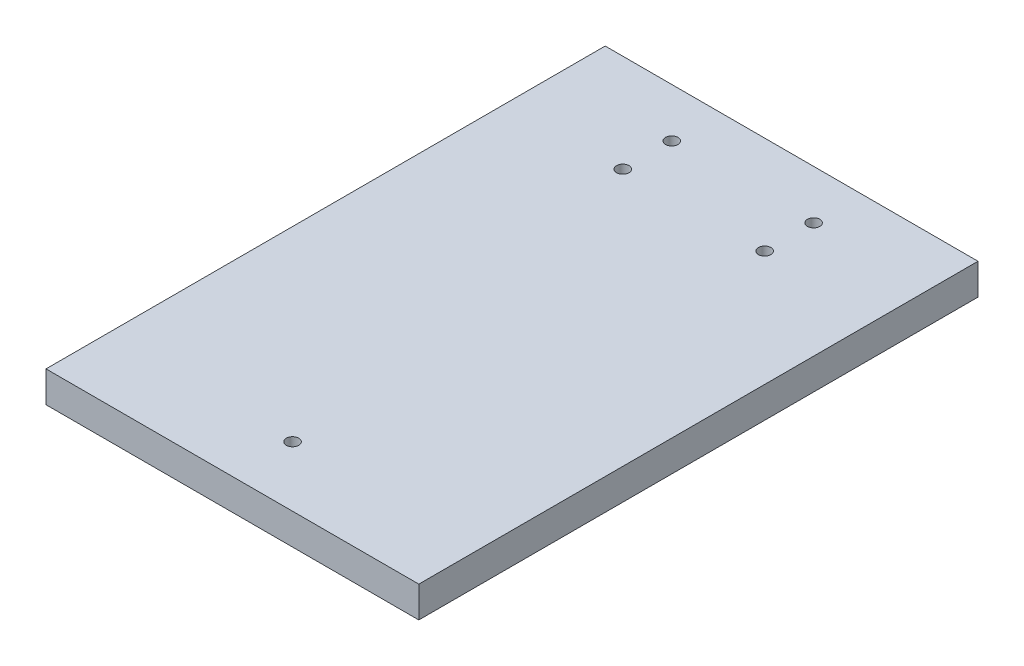
ISO-10303-21;
HEADER;
FILE_DESCRIPTION(('STEP AP214'),'2;1');
FILE_NAME('part.step','',(''),(''),'','','');
FILE_SCHEMA(('AUTOMOTIVE_DESIGN { 1 0 10303 214 1 1 1 1 }'));
ENDSEC;
DATA;
#1=APPLICATION_CONTEXT('core data for automotive mechanical design processes');
#2=APPLICATION_PROTOCOL_DEFINITION('international standard','automotive_design',2000,#1);
#3=PRODUCT_CONTEXT('',#1,'mechanical');
#4=PRODUCT('Part','Part','',(#3));
#5=PRODUCT_RELATED_PRODUCT_CATEGORY('part','',(#4));
#6=PRODUCT_DEFINITION_FORMATION('','',#4);
#7=PRODUCT_DEFINITION_CONTEXT('part definition',#1,'design');
#8=PRODUCT_DEFINITION('design','',#6,#7);
#9=PRODUCT_DEFINITION_SHAPE('','',#8);
#10=(LENGTH_UNIT() NAMED_UNIT(*) SI_UNIT(.MILLI.,.METRE.));
#11=(NAMED_UNIT(*) PLANE_ANGLE_UNIT() SI_UNIT($,.RADIAN.));
#12=(NAMED_UNIT(*) SI_UNIT($,.STERADIAN.) SOLID_ANGLE_UNIT());
#13=UNCERTAINTY_MEASURE_WITH_UNIT(LENGTH_MEASURE(1.E-05),#10,'distance_accuracy_value','');
#14=(GEOMETRIC_REPRESENTATION_CONTEXT(3) GLOBAL_UNCERTAINTY_ASSIGNED_CONTEXT((#13)) GLOBAL_UNIT_ASSIGNED_CONTEXT((#10,
#11,#12)) REPRESENTATION_CONTEXT('',''));
#15=CARTESIAN_POINT('',(0.,0.,0.));
#16=DIRECTION('',(0.,0.,1.));
#17=DIRECTION('',(1.,0.,0.));
#18=AXIS2_PLACEMENT_3D('',#15,#16,#17);
#19=CARTESIAN_POINT('',(0.,6.35,0.));
#20=DIRECTION('',(0.,-1.,0.));
#21=DIRECTION('',(0.,0.,-1.));
#22=AXIS2_PLACEMENT_3D('',#19,#20,#21);
#23=PLANE('',#22);
#24=DIRECTION('',(0.,0.,-1.));
#25=VECTOR('',#24,1.);
#26=CARTESIAN_POINT('',(38.1,6.35,57.15));
#27=LINE('',#26,#25);
#28=CARTESIAN_POINT('',(38.1,6.35,57.15));
#29=VERTEX_POINT('',#28);
#30=CARTESIAN_POINT('',(38.1,6.35,-57.15));
#31=VERTEX_POINT('',#30);
#32=EDGE_CURVE('E86',#29,#31,#27,.T.);
#33=ORIENTED_EDGE('',*,*,#32,.T.);
#34=DIRECTION('',(-1.,0.,0.));
#35=VECTOR('',#34,1.);
#36=CARTESIAN_POINT('',(-38.1,6.35,-57.15));
#37=LINE('',#36,#35);
#38=CARTESIAN_POINT('',(-38.1,6.35,-57.15));
#39=VERTEX_POINT('',#38);
#40=EDGE_CURVE('E81',#31,#39,#37,.T.);
#41=ORIENTED_EDGE('',*,*,#40,.T.);
#42=DIRECTION('',(0.,0.,1.));
#43=VECTOR('',#42,1.);
#44=CARTESIAN_POINT('',(-38.1,6.35,57.15));
#45=LINE('',#44,#43);
#46=CARTESIAN_POINT('',(-38.1,6.35,57.15));
#47=VERTEX_POINT('',#46);
#48=EDGE_CURVE('E84',#39,#47,#45,.T.);
#49=ORIENTED_EDGE('',*,*,#48,.T.);
#50=DIRECTION('',(1.,0.,0.));
#51=VECTOR('',#50,1.);
#52=CARTESIAN_POINT('',(-38.1,6.35,57.15));
#53=LINE('',#52,#51);
#54=EDGE_CURVE('E51',#47,#29,#53,.T.);
#55=ORIENTED_EDGE('',*,*,#54,.T.);
#56=EDGE_LOOP('',(#33,#41,#49,#55));
#57=FACE_BOUND('',#56,.T.);
#58=CARTESIAN_POINT('',(-14.5,6.35,-47.15));
#59=DIRECTION('',(0.,1.,0.));
#60=DIRECTION('',(0.,0.,1.));
#61=AXIS2_PLACEMENT_3D('',#58,#59,#60);
#62=CIRCLE('',#61,1.27);
#63=CARTESIAN_POINT('',(-14.5,6.35,-45.88));
#64=VERTEX_POINT('',#63);
#65=EDGE_CURVE('E101',#64,#64,#62,.T.);
#66=ORIENTED_EDGE('',*,*,#65,.F.);
#67=EDGE_LOOP('',(#66));
#68=FACE_BOUND('',#67,.T.);
#69=CARTESIAN_POINT('',(14.5,6.35,-47.15));
#70=DIRECTION('',(0.,1.,0.));
#71=DIRECTION('',(0.,0.,1.));
#72=AXIS2_PLACEMENT_3D('',#69,#70,#71);
#73=CIRCLE('',#72,1.27);
#74=CARTESIAN_POINT('',(14.5,6.35,-45.88));
#75=VERTEX_POINT('',#74);
#76=EDGE_CURVE('E116',#75,#75,#73,.T.);
#77=ORIENTED_EDGE('',*,*,#76,.F.);
#78=EDGE_LOOP('',(#77));
#79=FACE_BOUND('',#78,.T.);
#80=CARTESIAN_POINT('',(0.,6.35,44.85));
#81=DIRECTION('',(0.,1.,0.));
#82=DIRECTION('',(0.,0.,1.));
#83=AXIS2_PLACEMENT_3D('',#80,#81,#82);
#84=CIRCLE('',#83,1.27);
#85=CARTESIAN_POINT('',(0.,6.35,46.12));
#86=VERTEX_POINT('',#85);
#87=EDGE_CURVE('E122',#86,#86,#84,.T.);
#88=ORIENTED_EDGE('',*,*,#87,.F.);
#89=EDGE_LOOP('',(#88));
#90=FACE_BOUND('',#89,.T.);
#91=CARTESIAN_POINT('',(-14.5,6.35,-37.15));
#92=DIRECTION('',(0.,1.,0.));
#93=DIRECTION('',(0.,0.,1.));
#94=AXIS2_PLACEMENT_3D('',#91,#92,#93);
#95=CIRCLE('',#94,1.27);
#96=CARTESIAN_POINT('',(-14.5,6.35,-35.88));
#97=VERTEX_POINT('',#96);
#98=EDGE_CURVE('E128',#97,#97,#95,.T.);
#99=ORIENTED_EDGE('',*,*,#98,.F.);
#100=EDGE_LOOP('',(#99));
#101=FACE_BOUND('',#100,.T.);
#102=CARTESIAN_POINT('',(14.5,6.35,-37.15));
#103=DIRECTION('',(0.,1.,0.));
#104=DIRECTION('',(0.,0.,1.));
#105=AXIS2_PLACEMENT_3D('',#102,#103,#104);
#106=CIRCLE('',#105,1.27);
#107=CARTESIAN_POINT('',(14.5,6.35,-35.88));
#108=VERTEX_POINT('',#107);
#109=EDGE_CURVE('E134',#108,#108,#106,.T.);
#110=ORIENTED_EDGE('',*,*,#109,.F.);
#111=EDGE_LOOP('',(#110));
#112=FACE_BOUND('',#111,.T.);
#113=ADVANCED_FACE('F34',(#57,#68,#79,#90,#101,#112),#23,.F.);
#114=CARTESIAN_POINT('',(0.,0.,0.));
#115=DIRECTION('',(0.,-1.,0.));
#116=DIRECTION('',(0.,0.,-1.));
#117=AXIS2_PLACEMENT_3D('',#114,#115,#116);
#118=PLANE('',#117);
#119=CARTESIAN_POINT('',(-14.5,0.,-37.15));
#120=DIRECTION('',(0.,1.,0.));
#121=DIRECTION('',(0.,0.,1.));
#122=AXIS2_PLACEMENT_3D('',#119,#120,#121);
#123=CIRCLE('',#122,1.27);
#124=CARTESIAN_POINT('',(-14.5,0.,-35.88));
#125=VERTEX_POINT('',#124);
#126=EDGE_CURVE('E131',#125,#125,#123,.T.);
#127=ORIENTED_EDGE('',*,*,#126,.T.);
#128=EDGE_LOOP('',(#127));
#129=FACE_BOUND('',#128,.T.);
#130=CARTESIAN_POINT('',(14.5,0.,-47.15));
#131=DIRECTION('',(0.,1.,0.));
#132=DIRECTION('',(0.,0.,1.));
#133=AXIS2_PLACEMENT_3D('',#130,#131,#132);
#134=CIRCLE('',#133,1.27);
#135=CARTESIAN_POINT('',(14.5,0.,-45.88));
#136=VERTEX_POINT('',#135);
#137=EDGE_CURVE('E119',#136,#136,#134,.T.);
#138=ORIENTED_EDGE('',*,*,#137,.T.);
#139=EDGE_LOOP('',(#138));
#140=FACE_BOUND('',#139,.T.);
#141=DIRECTION('',(0.,0.,-1.));
#142=VECTOR('',#141,1.);
#143=CARTESIAN_POINT('',(38.1,0.,57.15));
#144=LINE('',#143,#142);
#145=CARTESIAN_POINT('',(38.1,0.,57.15));
#146=VERTEX_POINT('',#145);
#147=CARTESIAN_POINT('',(38.1,0.,-57.15));
#148=VERTEX_POINT('',#147);
#149=EDGE_CURVE('E98',#146,#148,#144,.T.);
#150=ORIENTED_EDGE('',*,*,#149,.F.);
#151=DIRECTION('',(1.,0.,0.));
#152=VECTOR('',#151,1.);
#153=CARTESIAN_POINT('',(-38.1,0.,57.15));
#154=LINE('',#153,#152);
#155=CARTESIAN_POINT('',(-38.1,0.,57.15));
#156=VERTEX_POINT('',#155);
#157=EDGE_CURVE('E74',#156,#146,#154,.T.);
#158=ORIENTED_EDGE('',*,*,#157,.F.);
#159=DIRECTION('',(0.,0.,1.));
#160=VECTOR('',#159,1.);
#161=CARTESIAN_POINT('',(-38.1,0.,57.15));
#162=LINE('',#161,#160);
#163=CARTESIAN_POINT('',(-38.1,0.,-57.15));
#164=VERTEX_POINT('',#163);
#165=EDGE_CURVE('E68',#164,#156,#162,.T.);
#166=ORIENTED_EDGE('',*,*,#165,.F.);
#167=DIRECTION('',(-1.,0.,0.));
#168=VECTOR('',#167,1.);
#169=CARTESIAN_POINT('',(-38.1,0.,-57.15));
#170=LINE('',#169,#168);
#171=EDGE_CURVE('E90',#148,#164,#170,.T.);
#172=ORIENTED_EDGE('',*,*,#171,.F.);
#173=EDGE_LOOP('',(#150,#158,#166,#172));
#174=FACE_BOUND('',#173,.T.);
#175=CARTESIAN_POINT('',(-14.5,0.,-47.15));
#176=DIRECTION('',(0.,1.,0.));
#177=DIRECTION('',(0.,0.,1.));
#178=AXIS2_PLACEMENT_3D('',#175,#176,#177);
#179=CIRCLE('',#178,1.27);
#180=CARTESIAN_POINT('',(-14.5,0.,-45.88));
#181=VERTEX_POINT('',#180);
#182=EDGE_CURVE('E113',#181,#181,#179,.T.);
#183=ORIENTED_EDGE('',*,*,#182,.T.);
#184=EDGE_LOOP('',(#183));
#185=FACE_BOUND('',#184,.T.);
#186=CARTESIAN_POINT('',(0.,0.,44.85));
#187=DIRECTION('',(0.,1.,0.));
#188=DIRECTION('',(0.,0.,1.));
#189=AXIS2_PLACEMENT_3D('',#186,#187,#188);
#190=CIRCLE('',#189,1.27);
#191=CARTESIAN_POINT('',(0.,0.,46.12));
#192=VERTEX_POINT('',#191);
#193=EDGE_CURVE('E125',#192,#192,#190,.T.);
#194=ORIENTED_EDGE('',*,*,#193,.T.);
#195=EDGE_LOOP('',(#194));
#196=FACE_BOUND('',#195,.T.);
#197=CARTESIAN_POINT('',(14.5,0.,-37.15));
#198=DIRECTION('',(0.,1.,0.));
#199=DIRECTION('',(0.,0.,1.));
#200=AXIS2_PLACEMENT_3D('',#197,#198,#199);
#201=CIRCLE('',#200,1.27);
#202=CARTESIAN_POINT('',(14.5,0.,-35.88));
#203=VERTEX_POINT('',#202);
#204=EDGE_CURVE('E137',#203,#203,#201,.T.);
#205=ORIENTED_EDGE('',*,*,#204,.T.);
#206=EDGE_LOOP('',(#205));
#207=FACE_BOUND('',#206,.T.);
#208=ADVANCED_FACE('F109',(#129,#140,#174,#185,#196,#207),#118,.T.);
#209=CARTESIAN_POINT('',(38.1,6.35,57.15));
#210=DIRECTION('',(-1.,0.,0.));
#211=DIRECTION('',(0.,0.,1.));
#212=AXIS2_PLACEMENT_3D('',#209,#210,#211);
#213=PLANE('',#212);
#214=ORIENTED_EDGE('',*,*,#149,.T.);
#215=DIRECTION('',(0.,-1.,0.));
#216=VECTOR('',#215,1.);
#217=CARTESIAN_POINT('',(38.1,6.35,-57.15));
#218=LINE('',#217,#216);
#219=EDGE_CURVE('E11',#31,#148,#218,.T.);
#220=ORIENTED_EDGE('',*,*,#219,.F.);
#221=ORIENTED_EDGE('',*,*,#32,.F.);
#222=DIRECTION('',(0.,-1.,0.));
#223=VECTOR('',#222,1.);
#224=CARTESIAN_POINT('',(38.1,6.35,57.15));
#225=LINE('',#224,#223);
#226=EDGE_CURVE('E94',#29,#146,#225,.T.);
#227=ORIENTED_EDGE('',*,*,#226,.T.);
#228=EDGE_LOOP('',(#214,#220,#221,#227));
#229=FACE_BOUND('',#228,.T.);
#230=ADVANCED_FACE('F36',(#229),#213,.F.);
#231=CARTESIAN_POINT('',(-38.1,6.35,-57.15));
#232=DIRECTION('',(0.,0.,1.));
#233=DIRECTION('',(1.,0.,0.));
#234=AXIS2_PLACEMENT_3D('',#231,#232,#233);
#235=PLANE('',#234);
#236=ORIENTED_EDGE('',*,*,#171,.T.);
#237=DIRECTION('',(0.,-1.,0.));
#238=VECTOR('',#237,1.);
#239=CARTESIAN_POINT('',(-38.1,6.35,-57.15));
#240=LINE('',#239,#238);
#241=EDGE_CURVE('E43',#39,#164,#240,.T.);
#242=ORIENTED_EDGE('',*,*,#241,.F.);
#243=ORIENTED_EDGE('',*,*,#40,.F.);
#244=ORIENTED_EDGE('',*,*,#219,.T.);
#245=EDGE_LOOP('',(#236,#242,#243,#244));
#246=FACE_BOUND('',#245,.T.);
#247=ADVANCED_FACE('F89',(#246),#235,.F.);
#248=CARTESIAN_POINT('',(-38.1,6.35,57.15));
#249=DIRECTION('',(1.,0.,0.));
#250=DIRECTION('',(0.,0.,-1.));
#251=AXIS2_PLACEMENT_3D('',#248,#249,#250);
#252=PLANE('',#251);
#253=ORIENTED_EDGE('',*,*,#165,.T.);
#254=DIRECTION('',(0.,-1.,0.));
#255=VECTOR('',#254,1.);
#256=CARTESIAN_POINT('',(-38.1,6.35,57.15));
#257=LINE('',#256,#255);
#258=EDGE_CURVE('E91',#47,#156,#257,.T.);
#259=ORIENTED_EDGE('',*,*,#258,.F.);
#260=ORIENTED_EDGE('',*,*,#48,.F.);
#261=ORIENTED_EDGE('',*,*,#241,.T.);
#262=EDGE_LOOP('',(#253,#259,#260,#261));
#263=FACE_BOUND('',#262,.T.);
#264=ADVANCED_FACE('F92',(#263),#252,.F.);
#265=CARTESIAN_POINT('',(-38.1,6.35,57.15));
#266=DIRECTION('',(0.,0.,-1.));
#267=DIRECTION('',(-1.,0.,0.));
#268=AXIS2_PLACEMENT_3D('',#265,#266,#267);
#269=PLANE('',#268);
#270=ORIENTED_EDGE('',*,*,#157,.T.);
#271=ORIENTED_EDGE('',*,*,#226,.F.);
#272=ORIENTED_EDGE('',*,*,#54,.F.);
#273=ORIENTED_EDGE('',*,*,#258,.T.);
#274=EDGE_LOOP('',(#270,#271,#272,#273));
#275=FACE_BOUND('',#274,.T.);
#276=ADVANCED_FACE('F106',(#275),#269,.F.);
#277=CARTESIAN_POINT('',(-14.5,6.35,-47.15));
#278=DIRECTION('',(0.,-1.,0.));
#279=DIRECTION('',(0.,0.,-1.));
#280=AXIS2_PLACEMENT_3D('',#277,#278,#279);
#281=CYLINDRICAL_SURFACE('',#280,1.27);
#282=ORIENTED_EDGE('',*,*,#65,.T.);
#283=EDGE_LOOP('',(#282));
#284=FACE_BOUND('',#283,.T.);
#285=ORIENTED_EDGE('',*,*,#182,.F.);
#286=EDGE_LOOP('',(#285));
#287=FACE_BOUND('',#286,.T.);
#288=ADVANCED_FACE('F154',(#284,#287),#281,.F.);
#289=CARTESIAN_POINT('',(14.5,6.35,-47.15));
#290=DIRECTION('',(0.,-1.,0.));
#291=DIRECTION('',(0.,0.,-1.));
#292=AXIS2_PLACEMENT_3D('',#289,#290,#291);
#293=CYLINDRICAL_SURFACE('',#292,1.27);
#294=ORIENTED_EDGE('',*,*,#76,.T.);
#295=EDGE_LOOP('',(#294));
#296=FACE_BOUND('',#295,.T.);
#297=ORIENTED_EDGE('',*,*,#137,.F.);
#298=EDGE_LOOP('',(#297));
#299=FACE_BOUND('',#298,.T.);
#300=ADVANCED_FACE('F200',(#296,#299),#293,.F.);
#301=CARTESIAN_POINT('',(0.,6.35,44.85));
#302=DIRECTION('',(0.,-1.,0.));
#303=DIRECTION('',(0.,0.,-1.));
#304=AXIS2_PLACEMENT_3D('',#301,#302,#303);
#305=CYLINDRICAL_SURFACE('',#304,1.27);
#306=ORIENTED_EDGE('',*,*,#87,.T.);
#307=EDGE_LOOP('',(#306));
#308=FACE_BOUND('',#307,.T.);
#309=ORIENTED_EDGE('',*,*,#193,.F.);
#310=EDGE_LOOP('',(#309));
#311=FACE_BOUND('',#310,.T.);
#312=ADVANCED_FACE('F208',(#308,#311),#305,.F.);
#313=CARTESIAN_POINT('',(-14.5,6.35,-37.15));
#314=DIRECTION('',(0.,-1.,0.));
#315=DIRECTION('',(0.,0.,-1.));
#316=AXIS2_PLACEMENT_3D('',#313,#314,#315);
#317=CYLINDRICAL_SURFACE('',#316,1.27);
#318=ORIENTED_EDGE('',*,*,#98,.T.);
#319=EDGE_LOOP('',(#318));
#320=FACE_BOUND('',#319,.T.);
#321=ORIENTED_EDGE('',*,*,#126,.F.);
#322=EDGE_LOOP('',(#321));
#323=FACE_BOUND('',#322,.T.);
#324=ADVANCED_FACE('F216',(#320,#323),#317,.F.);
#325=CARTESIAN_POINT('',(14.5,6.35,-37.15));
#326=DIRECTION('',(0.,-1.,0.));
#327=DIRECTION('',(0.,0.,-1.));
#328=AXIS2_PLACEMENT_3D('',#325,#326,#327);
#329=CYLINDRICAL_SURFACE('',#328,1.27);
#330=ORIENTED_EDGE('',*,*,#109,.T.);
#331=EDGE_LOOP('',(#330));
#332=FACE_BOUND('',#331,.T.);
#333=ORIENTED_EDGE('',*,*,#204,.F.);
#334=EDGE_LOOP('',(#333));
#335=FACE_BOUND('',#334,.T.);
#336=ADVANCED_FACE('F143',(#332,#335),#329,.F.);
#337=CLOSED_SHELL('',(#113,#208,#230,#247,#264,#276,#288,#300,#312,#324,#336));
#338=MANIFOLD_SOLID_BREP('B2',#337);
#339=ADVANCED_BREP_SHAPE_REPRESENTATION('',(#18,#338),#14);
#340=SHAPE_DEFINITION_REPRESENTATION(#9,#339);
ENDSEC;
END-ISO-10303-21;
